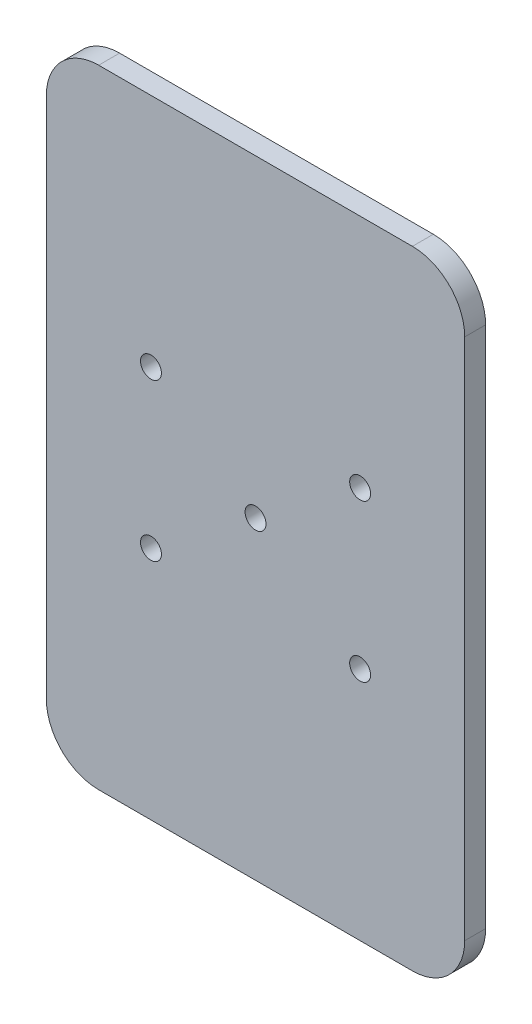
ISO-10303-21;
HEADER;
FILE_DESCRIPTION(('STEP AP214'),'2;1');
FILE_NAME('part.step','',(''),(''),'','','');
FILE_SCHEMA(('AUTOMOTIVE_DESIGN { 1 0 10303 214 1 1 1 1 }'));
ENDSEC;
DATA;
#1=APPLICATION_CONTEXT('core data for automotive mechanical design processes');
#2=APPLICATION_PROTOCOL_DEFINITION('international standard','automotive_design',2000,#1);
#3=PRODUCT_CONTEXT('',#1,'mechanical');
#4=PRODUCT('Part','Part','',(#3));
#5=PRODUCT_RELATED_PRODUCT_CATEGORY('part','',(#4));
#6=PRODUCT_DEFINITION_FORMATION('','',#4);
#7=PRODUCT_DEFINITION_CONTEXT('part definition',#1,'design');
#8=PRODUCT_DEFINITION('design','',#6,#7);
#9=PRODUCT_DEFINITION_SHAPE('','',#8);
#10=(LENGTH_UNIT() NAMED_UNIT(*) SI_UNIT(.MILLI.,.METRE.));
#11=(NAMED_UNIT(*) PLANE_ANGLE_UNIT() SI_UNIT($,.RADIAN.));
#12=(NAMED_UNIT(*) SI_UNIT($,.STERADIAN.) SOLID_ANGLE_UNIT());
#13=UNCERTAINTY_MEASURE_WITH_UNIT(LENGTH_MEASURE(1.E-05),#10,'distance_accuracy_value','');
#14=(GEOMETRIC_REPRESENTATION_CONTEXT(3) GLOBAL_UNCERTAINTY_ASSIGNED_CONTEXT((#13)) GLOBAL_UNIT_ASSIGNED_CONTEXT((#10,
#11,#12)) REPRESENTATION_CONTEXT('',''));
#15=CARTESIAN_POINT('',(0.,0.,0.));
#16=DIRECTION('',(0.,0.,1.));
#17=DIRECTION('',(1.,0.,0.));
#18=AXIS2_PLACEMENT_3D('',#15,#16,#17);
#19=CARTESIAN_POINT('',(-65.9850692997892,26.8064344030394,-2.));
#20=DIRECTION('',(0.,-1.,0.));
#21=DIRECTION('',(0.,0.,-1.));
#22=AXIS2_PLACEMENT_3D('',#19,#20,#21);
#23=PLANE('',#22);
#24=DIRECTION('',(1.,0.,0.));
#25=VECTOR('',#24,1.);
#26=CARTESIAN_POINT('',(-65.9850692997892,26.8064344030394,0.));
#27=LINE('',#26,#25);
#28=CARTESIAN_POINT('',(-60.9850692997892,26.8064344030394,0.));
#29=VERTEX_POINT('',#28);
#30=CARTESIAN_POINT('',(-30.9850692997892,26.8064344030394,0.));
#31=VERTEX_POINT('',#30);
#32=EDGE_CURVE('E148',#29,#31,#27,.T.);
#33=ORIENTED_EDGE('',*,*,#32,.T.);
#34=DIRECTION('',(0.,0.,1.));
#35=VECTOR('',#34,1.);
#36=CARTESIAN_POINT('',(-30.9850692997892,26.8064344030394,-2.));
#37=LINE('',#36,#35);
#38=CARTESIAN_POINT('',(-30.9850692997892,26.8064344030394,-2.));
#39=VERTEX_POINT('',#38);
#40=EDGE_CURVE('E123',#31,#39,#37,.F.);
#41=ORIENTED_EDGE('',*,*,#40,.T.);
#42=DIRECTION('',(1.,0.,0.));
#43=VECTOR('',#42,1.);
#44=CARTESIAN_POINT('',(-65.9850692997892,26.8064344030394,-2.));
#45=LINE('',#44,#43);
#46=CARTESIAN_POINT('',(-60.9850692997892,26.8064344030394,-2.));
#47=VERTEX_POINT('',#46);
#48=EDGE_CURVE('E161',#47,#39,#45,.T.);
#49=ORIENTED_EDGE('',*,*,#48,.F.);
#50=DIRECTION('',(0.,0.,1.));
#51=VECTOR('',#50,1.);
#52=CARTESIAN_POINT('',(-60.9850692997892,26.8064344030394,0.));
#53=LINE('',#52,#51);
#54=EDGE_CURVE('E129',#47,#29,#53,.T.);
#55=ORIENTED_EDGE('',*,*,#54,.T.);
#56=EDGE_LOOP('',(#33,#41,#49,#55));
#57=FACE_BOUND('',#56,.T.);
#58=ADVANCED_FACE('F49',(#57),#23,.F.);
#59=CARTESIAN_POINT('',(-25.9850692997892,26.8064344030394,-2.));
#60=DIRECTION('',(-1.,0.,0.));
#61=DIRECTION('',(0.,-1.,0.));
#62=AXIS2_PLACEMENT_3D('',#59,#60,#61);
#63=PLANE('',#62);
#64=DIRECTION('',(0.,-1.,0.));
#65=VECTOR('',#64,1.);
#66=CARTESIAN_POINT('',(-25.9850692997892,26.8064344030394,-2.));
#67=LINE('',#66,#65);
#68=CARTESIAN_POINT('',(-25.9850692997892,21.8064344030394,-2.));
#69=VERTEX_POINT('',#68);
#70=CARTESIAN_POINT('',(-25.9850692997892,-28.1935655969606,-2.));
#71=VERTEX_POINT('',#70);
#72=EDGE_CURVE('E139',#69,#71,#67,.T.);
#73=ORIENTED_EDGE('',*,*,#72,.F.);
#74=DIRECTION('',(0.,0.,1.));
#75=VECTOR('',#74,1.);
#76=CARTESIAN_POINT('',(-25.9850692997892,21.8064344030394,-2.));
#77=LINE('',#76,#75);
#78=CARTESIAN_POINT('',(-25.9850692997892,21.8064344030394,0.));
#79=VERTEX_POINT('',#78);
#80=EDGE_CURVE('E122',#69,#79,#77,.T.);
#81=ORIENTED_EDGE('',*,*,#80,.T.);
#82=DIRECTION('',(0.,-1.,0.));
#83=VECTOR('',#82,1.);
#84=CARTESIAN_POINT('',(-25.9850692997892,26.8064344030394,0.));
#85=LINE('',#84,#83);
#86=CARTESIAN_POINT('',(-25.9850692997892,-28.1935655969606,0.));
#87=VERTEX_POINT('',#86);
#88=EDGE_CURVE('E136',#79,#87,#85,.T.);
#89=ORIENTED_EDGE('',*,*,#88,.T.);
#90=DIRECTION('',(0.,0.,1.));
#91=VECTOR('',#90,1.);
#92=CARTESIAN_POINT('',(-25.9850692997892,-28.1935655969606,-2.));
#93=LINE('',#92,#91);
#94=EDGE_CURVE('E142',#87,#71,#93,.F.);
#95=ORIENTED_EDGE('',*,*,#94,.T.);
#96=EDGE_LOOP('',(#73,#81,#89,#95));
#97=FACE_BOUND('',#96,.T.);
#98=ADVANCED_FACE('F135',(#97),#63,.F.);
#99=CARTESIAN_POINT('',(-65.9850692997892,-33.1935655969606,-2.));
#100=DIRECTION('',(0.,-1.,0.));
#101=DIRECTION('',(0.,0.,-1.));
#102=AXIS2_PLACEMENT_3D('',#99,#100,#101);
#103=PLANE('',#102);
#104=DIRECTION('',(1.,0.,0.));
#105=VECTOR('',#104,1.);
#106=CARTESIAN_POINT('',(-65.9850692997892,-33.1935655969606,-2.));
#107=LINE('',#106,#105);
#108=CARTESIAN_POINT('',(-60.9850692997892,-33.1935655969606,-2.));
#109=VERTEX_POINT('',#108);
#110=CARTESIAN_POINT('',(-30.9850692997892,-33.1935655969606,-2.));
#111=VERTEX_POINT('',#110);
#112=EDGE_CURVE('E234',#109,#111,#107,.T.);
#113=ORIENTED_EDGE('',*,*,#112,.T.);
#114=DIRECTION('',(0.,0.,1.));
#115=VECTOR('',#114,1.);
#116=CARTESIAN_POINT('',(-30.9850692997892,-33.1935655969606,0.));
#117=LINE('',#116,#115);
#118=CARTESIAN_POINT('',(-30.9850692997892,-33.1935655969606,0.));
#119=VERTEX_POINT('',#118);
#120=EDGE_CURVE('E191',#111,#119,#117,.T.);
#121=ORIENTED_EDGE('',*,*,#120,.T.);
#122=DIRECTION('',(1.,0.,0.));
#123=VECTOR('',#122,1.);
#124=CARTESIAN_POINT('',(-65.9850692997892,-33.1935655969606,0.));
#125=LINE('',#124,#123);
#126=CARTESIAN_POINT('',(-60.9850692997892,-33.1935655969606,0.));
#127=VERTEX_POINT('',#126);
#128=EDGE_CURVE('E147',#127,#119,#125,.T.);
#129=ORIENTED_EDGE('',*,*,#128,.F.);
#130=DIRECTION('',(0.,0.,1.));
#131=VECTOR('',#130,1.);
#132=CARTESIAN_POINT('',(-60.9850692997892,-33.1935655969606,-2.));
#133=LINE('',#132,#131);
#134=EDGE_CURVE('E188',#127,#109,#133,.F.);
#135=ORIENTED_EDGE('',*,*,#134,.T.);
#136=EDGE_LOOP('',(#113,#121,#129,#135));
#137=FACE_BOUND('',#136,.T.);
#138=ADVANCED_FACE('F246',(#137),#103,.T.);
#139=CARTESIAN_POINT('',(-65.9850692997892,26.8064344030394,-2.));
#140=DIRECTION('',(-1.,0.,0.));
#141=DIRECTION('',(0.,-1.,0.));
#142=AXIS2_PLACEMENT_3D('',#139,#140,#141);
#143=PLANE('',#142);
#144=DIRECTION('',(0.,-1.,0.));
#145=VECTOR('',#144,1.);
#146=CARTESIAN_POINT('',(-65.9850692997892,26.8064344030394,-2.));
#147=LINE('',#146,#145);
#148=CARTESIAN_POINT('',(-65.9850692997892,21.8064344030394,-2.));
#149=VERTEX_POINT('',#148);
#150=CARTESIAN_POINT('',(-65.9850692997892,-28.1935655969606,-2.));
#151=VERTEX_POINT('',#150);
#152=EDGE_CURVE('E163',#149,#151,#147,.T.);
#153=ORIENTED_EDGE('',*,*,#152,.T.);
#154=DIRECTION('',(0.,0.,1.));
#155=VECTOR('',#154,1.);
#156=CARTESIAN_POINT('',(-65.9850692997892,-28.1935655969606,-2.));
#157=LINE('',#156,#155);
#158=CARTESIAN_POINT('',(-65.9850692997892,-28.1935655969606,0.));
#159=VERTEX_POINT('',#158);
#160=EDGE_CURVE('E11',#151,#159,#157,.T.);
#161=ORIENTED_EDGE('',*,*,#160,.T.);
#162=DIRECTION('',(0.,-1.,0.));
#163=VECTOR('',#162,1.);
#164=CARTESIAN_POINT('',(-65.9850692997892,26.8064344030394,0.));
#165=LINE('',#164,#163);
#166=CARTESIAN_POINT('',(-65.9850692997892,21.8064344030394,0.));
#167=VERTEX_POINT('',#166);
#168=EDGE_CURVE('E152',#167,#159,#165,.T.);
#169=ORIENTED_EDGE('',*,*,#168,.F.);
#170=DIRECTION('',(0.,0.,1.));
#171=VECTOR('',#170,1.);
#172=CARTESIAN_POINT('',(-65.9850692997892,21.8064344030394,-2.));
#173=LINE('',#172,#171);
#174=EDGE_CURVE('E59',#167,#149,#173,.F.);
#175=ORIENTED_EDGE('',*,*,#174,.T.);
#176=EDGE_LOOP('',(#153,#161,#169,#175));
#177=FACE_BOUND('',#176,.T.);
#178=ADVANCED_FACE('F239',(#177),#143,.T.);
#179=CARTESIAN_POINT('',(0.,0.,-2.));
#180=DIRECTION('',(0.,0.,-1.));
#181=DIRECTION('',(-1.,0.,0.));
#182=AXIS2_PLACEMENT_3D('',#179,#180,#181);
#183=PLANE('',#182);
#184=CARTESIAN_POINT('',(-35.9850692997892,4.30643440303937,-2.));
#185=DIRECTION('',(0.,0.,-1.));
#186=DIRECTION('',(-1.,0.,0.));
#187=AXIS2_PLACEMENT_3D('',#184,#185,#186);
#188=CIRCLE('',#187,0.999999999999998);
#189=CARTESIAN_POINT('',(-36.9850692997892,4.30643440303937,-2.));
#190=VERTEX_POINT('',#189);
#191=EDGE_CURVE('E204',#190,#190,#188,.T.);
#192=ORIENTED_EDGE('',*,*,#191,.F.);
#193=EDGE_LOOP('',(#192));
#194=FACE_BOUND('',#193,.T.);
#195=CARTESIAN_POINT('',(-35.9850692997892,-10.6935655969606,-2.));
#196=DIRECTION('',(0.,0.,-1.));
#197=DIRECTION('',(-1.,0.,0.));
#198=AXIS2_PLACEMENT_3D('',#195,#196,#197);
#199=CIRCLE('',#198,0.999999999999998);
#200=CARTESIAN_POINT('',(-36.9850692997892,-10.6935655969606,-2.));
#201=VERTEX_POINT('',#200);
#202=EDGE_CURVE('E212',#201,#201,#199,.T.);
#203=ORIENTED_EDGE('',*,*,#202,.F.);
#204=EDGE_LOOP('',(#203));
#205=FACE_BOUND('',#204,.T.);
#206=CARTESIAN_POINT('',(-55.9850692997892,4.30643440303937,-2.));
#207=DIRECTION('',(0.,0.,-1.));
#208=DIRECTION('',(-1.,0.,0.));
#209=AXIS2_PLACEMENT_3D('',#206,#207,#208);
#210=CIRCLE('',#209,0.999999999999998);
#211=CARTESIAN_POINT('',(-56.9850692997892,4.30643440303937,-2.));
#212=VERTEX_POINT('',#211);
#213=EDGE_CURVE('E222',#212,#212,#210,.F.);
#214=ORIENTED_EDGE('',*,*,#213,.T.);
#215=EDGE_LOOP('',(#214));
#216=FACE_BOUND('',#215,.T.);
#217=CARTESIAN_POINT('',(-55.9850692997892,-10.6935655969606,-2.));
#218=DIRECTION('',(0.,0.,-1.));
#219=DIRECTION('',(-1.,0.,0.));
#220=AXIS2_PLACEMENT_3D('',#217,#218,#219);
#221=CIRCLE('',#220,0.999999999999998);
#222=CARTESIAN_POINT('',(-56.9850692997892,-10.6935655969606,-2.));
#223=VERTEX_POINT('',#222);
#224=EDGE_CURVE('E203',#223,#223,#221,.F.);
#225=ORIENTED_EDGE('',*,*,#224,.T.);
#226=EDGE_LOOP('',(#225));
#227=FACE_BOUND('',#226,.T.);
#228=CARTESIAN_POINT('',(-45.9850692997892,-3.19356559696063,-2.));
#229=DIRECTION('',(0.,0.,-1.));
#230=DIRECTION('',(-1.,0.,0.));
#231=AXIS2_PLACEMENT_3D('',#228,#229,#230);
#232=CIRCLE('',#231,0.999999999999998);
#233=CARTESIAN_POINT('',(-46.9850692997892,-3.19356559696063,-2.));
#234=VERTEX_POINT('',#233);
#235=EDGE_CURVE('E199',#234,#234,#232,.T.);
#236=ORIENTED_EDGE('',*,*,#235,.F.);
#237=EDGE_LOOP('',(#236));
#238=FACE_BOUND('',#237,.T.);
#239=ORIENTED_EDGE('',*,*,#48,.T.);
#240=CARTESIAN_POINT('',(-30.9850692997892,21.8064344030394,-2.));
#241=DIRECTION('',(0.,0.,-1.));
#242=DIRECTION('',(-1.,0.,0.));
#243=AXIS2_PLACEMENT_3D('',#240,#241,#242);
#244=CIRCLE('',#243,5.);
#245=EDGE_CURVE('E185',#39,#69,#244,.T.);
#246=ORIENTED_EDGE('',*,*,#245,.T.);
#247=ORIENTED_EDGE('',*,*,#72,.T.);
#248=CARTESIAN_POINT('',(-30.9850692997892,-28.1935655969606,-2.));
#249=DIRECTION('',(0.,0.,-1.));
#250=DIRECTION('',(-1.,0.,0.));
#251=AXIS2_PLACEMENT_3D('',#248,#249,#250);
#252=CIRCLE('',#251,5.);
#253=EDGE_CURVE('E182',#71,#111,#252,.T.);
#254=ORIENTED_EDGE('',*,*,#253,.T.);
#255=ORIENTED_EDGE('',*,*,#112,.F.);
#256=CARTESIAN_POINT('',(-60.9850692997892,-28.1935655969606,-2.));
#257=DIRECTION('',(0.,0.,-1.));
#258=DIRECTION('',(-1.,0.,0.));
#259=AXIS2_PLACEMENT_3D('',#256,#257,#258);
#260=CIRCLE('',#259,5.);
#261=EDGE_CURVE('E67',#109,#151,#260,.T.);
#262=ORIENTED_EDGE('',*,*,#261,.T.);
#263=ORIENTED_EDGE('',*,*,#152,.F.);
#264=CARTESIAN_POINT('',(-60.9850692997892,21.8064344030394,-2.));
#265=DIRECTION('',(0.,0.,-1.));
#266=DIRECTION('',(-1.,0.,0.));
#267=AXIS2_PLACEMENT_3D('',#264,#265,#266);
#268=CIRCLE('',#267,5.);
#269=EDGE_CURVE('E177',#149,#47,#268,.T.);
#270=ORIENTED_EDGE('',*,*,#269,.T.);
#271=EDGE_LOOP('',(#239,#246,#247,#254,#255,#262,#263,#270));
#272=FACE_BOUND('',#271,.T.);
#273=ADVANCED_FACE('F251',(#194,#205,#216,#227,#238,#272),#183,.T.);
#274=CARTESIAN_POINT('',(0.,0.,0.));
#275=DIRECTION('',(0.,0.,-1.));
#276=DIRECTION('',(-1.,0.,0.));
#277=AXIS2_PLACEMENT_3D('',#274,#275,#276);
#278=PLANE('',#277);
#279=CARTESIAN_POINT('',(-35.9850692997892,4.30643440303937,0.));
#280=DIRECTION('',(0.,0.,1.));
#281=DIRECTION('',(1.,0.,0.));
#282=AXIS2_PLACEMENT_3D('',#279,#280,#281);
#283=CIRCLE('',#282,0.999999999999998);
#284=CARTESIAN_POINT('',(-34.9850692997892,4.30643440303937,0.));
#285=VERTEX_POINT('',#284);
#286=EDGE_CURVE('E218',#285,#285,#283,.T.);
#287=ORIENTED_EDGE('',*,*,#286,.F.);
#288=EDGE_LOOP('',(#287));
#289=FACE_BOUND('',#288,.T.);
#290=CARTESIAN_POINT('',(-35.9850692997892,-10.6935655969606,0.));
#291=DIRECTION('',(0.,0.,1.));
#292=DIRECTION('',(1.,0.,0.));
#293=AXIS2_PLACEMENT_3D('',#290,#291,#292);
#294=CIRCLE('',#293,0.999999999999998);
#295=CARTESIAN_POINT('',(-34.9850692997892,-10.6935655969606,0.));
#296=VERTEX_POINT('',#295);
#297=EDGE_CURVE('E412',#296,#296,#294,.T.);
#298=ORIENTED_EDGE('',*,*,#297,.F.);
#299=EDGE_LOOP('',(#298));
#300=FACE_BOUND('',#299,.T.);
#301=CARTESIAN_POINT('',(-55.9850692997892,4.30643440303937,0.));
#302=DIRECTION('',(0.,0.,-1.));
#303=DIRECTION('',(-1.,0.,0.));
#304=AXIS2_PLACEMENT_3D('',#301,#302,#303);
#305=CIRCLE('',#304,0.999999999999998);
#306=CARTESIAN_POINT('',(-56.9850692997892,4.30643440303937,0.));
#307=VERTEX_POINT('',#306);
#308=EDGE_CURVE('E53',#307,#307,#305,.F.);
#309=ORIENTED_EDGE('',*,*,#308,.F.);
#310=EDGE_LOOP('',(#309));
#311=FACE_BOUND('',#310,.T.);
#312=CARTESIAN_POINT('',(-55.9850692997892,-10.6935655969606,0.));
#313=DIRECTION('',(0.,0.,-1.));
#314=DIRECTION('',(-1.,0.,0.));
#315=AXIS2_PLACEMENT_3D('',#312,#313,#314);
#316=CIRCLE('',#315,0.999999999999998);
#317=CARTESIAN_POINT('',(-56.9850692997892,-10.6935655969606,0.));
#318=VERTEX_POINT('',#317);
#319=EDGE_CURVE('E200',#318,#318,#316,.F.);
#320=ORIENTED_EDGE('',*,*,#319,.F.);
#321=EDGE_LOOP('',(#320));
#322=FACE_BOUND('',#321,.T.);
#323=CARTESIAN_POINT('',(-45.9850692997892,-3.19356559696063,0.));
#324=DIRECTION('',(0.,0.,-1.));
#325=DIRECTION('',(-1.,0.,0.));
#326=AXIS2_PLACEMENT_3D('',#323,#324,#325);
#327=CIRCLE('',#326,0.999999999999998);
#328=CARTESIAN_POINT('',(-46.9850692997892,-3.19356559696063,0.));
#329=VERTEX_POINT('',#328);
#330=EDGE_CURVE('E154',#329,#329,#327,.T.);
#331=ORIENTED_EDGE('',*,*,#330,.T.);
#332=EDGE_LOOP('',(#331));
#333=FACE_BOUND('',#332,.T.);
#334=ORIENTED_EDGE('',*,*,#88,.F.);
#335=CARTESIAN_POINT('',(-30.9850692997892,21.8064344030394,0.));
#336=DIRECTION('',(0.,0.,-1.));
#337=DIRECTION('',(-1.,0.,0.));
#338=AXIS2_PLACEMENT_3D('',#335,#336,#337);
#339=CIRCLE('',#338,5.);
#340=EDGE_CURVE('E118',#79,#31,#339,.F.);
#341=ORIENTED_EDGE('',*,*,#340,.T.);
#342=ORIENTED_EDGE('',*,*,#32,.F.);
#343=CARTESIAN_POINT('',(-60.9850692997892,21.8064344030394,0.));
#344=DIRECTION('',(0.,0.,-1.));
#345=DIRECTION('',(-1.,0.,0.));
#346=AXIS2_PLACEMENT_3D('',#343,#344,#345);
#347=CIRCLE('',#346,5.);
#348=EDGE_CURVE('E141',#29,#167,#347,.F.);
#349=ORIENTED_EDGE('',*,*,#348,.T.);
#350=ORIENTED_EDGE('',*,*,#168,.T.);
#351=CARTESIAN_POINT('',(-60.9850692997892,-28.1935655969606,0.));
#352=DIRECTION('',(0.,0.,-1.));
#353=DIRECTION('',(-1.,0.,0.));
#354=AXIS2_PLACEMENT_3D('',#351,#352,#353);
#355=CIRCLE('',#354,5.);
#356=EDGE_CURVE('E167',#159,#127,#355,.F.);
#357=ORIENTED_EDGE('',*,*,#356,.T.);
#358=ORIENTED_EDGE('',*,*,#128,.T.);
#359=CARTESIAN_POINT('',(-30.9850692997892,-28.1935655969606,0.));
#360=DIRECTION('',(0.,0.,-1.));
#361=DIRECTION('',(-1.,0.,0.));
#362=AXIS2_PLACEMENT_3D('',#359,#360,#361);
#363=CIRCLE('',#362,5.);
#364=EDGE_CURVE('E130',#119,#87,#363,.F.);
#365=ORIENTED_EDGE('',*,*,#364,.T.);
#366=EDGE_LOOP('',(#334,#341,#342,#349,#350,#357,#358,#365));
#367=FACE_BOUND('',#366,.T.);
#368=ADVANCED_FACE('F144',(#289,#300,#311,#322,#333,#367),#278,.F.);
#369=CARTESIAN_POINT('',(-30.9850692997892,21.8064344030394,-2.));
#370=DIRECTION('',(0.,0.,1.));
#371=DIRECTION('',(1.,0.,0.));
#372=AXIS2_PLACEMENT_3D('',#369,#370,#371);
#373=CYLINDRICAL_SURFACE('',#372,5.);
#374=ORIENTED_EDGE('',*,*,#245,.F.);
#375=ORIENTED_EDGE('',*,*,#40,.F.);
#376=ORIENTED_EDGE('',*,*,#340,.F.);
#377=ORIENTED_EDGE('',*,*,#80,.F.);
#378=EDGE_LOOP('',(#374,#375,#376,#377));
#379=FACE_BOUND('',#378,.T.);
#380=ADVANCED_FACE('F121',(#379),#373,.T.);
#381=CARTESIAN_POINT('',(-30.9850692997892,-28.1935655969606,-2.));
#382=DIRECTION('',(0.,0.,-1.));
#383=DIRECTION('',(-1.,0.,0.));
#384=AXIS2_PLACEMENT_3D('',#381,#382,#383);
#385=CYLINDRICAL_SURFACE('',#384,5.);
#386=ORIENTED_EDGE('',*,*,#253,.F.);
#387=ORIENTED_EDGE('',*,*,#94,.F.);
#388=ORIENTED_EDGE('',*,*,#364,.F.);
#389=ORIENTED_EDGE('',*,*,#120,.F.);
#390=EDGE_LOOP('',(#386,#387,#388,#389));
#391=FACE_BOUND('',#390,.T.);
#392=ADVANCED_FACE('F250',(#391),#385,.T.);
#393=CARTESIAN_POINT('',(-60.9850692997892,-28.1935655969606,-2.));
#394=DIRECTION('',(0.,0.,1.));
#395=DIRECTION('',(1.,0.,0.));
#396=AXIS2_PLACEMENT_3D('',#393,#394,#395);
#397=CYLINDRICAL_SURFACE('',#396,5.);
#398=ORIENTED_EDGE('',*,*,#261,.F.);
#399=ORIENTED_EDGE('',*,*,#134,.F.);
#400=ORIENTED_EDGE('',*,*,#356,.F.);
#401=ORIENTED_EDGE('',*,*,#160,.F.);
#402=EDGE_LOOP('',(#398,#399,#400,#401));
#403=FACE_BOUND('',#402,.T.);
#404=ADVANCED_FACE('F242',(#403),#397,.T.);
#405=CARTESIAN_POINT('',(-60.9850692997892,21.8064344030394,-2.));
#406=DIRECTION('',(0.,0.,-1.));
#407=DIRECTION('',(-1.,0.,0.));
#408=AXIS2_PLACEMENT_3D('',#405,#406,#407);
#409=CYLINDRICAL_SURFACE('',#408,5.);
#410=ORIENTED_EDGE('',*,*,#269,.F.);
#411=ORIENTED_EDGE('',*,*,#174,.F.);
#412=ORIENTED_EDGE('',*,*,#348,.F.);
#413=ORIENTED_EDGE('',*,*,#54,.F.);
#414=EDGE_LOOP('',(#410,#411,#412,#413));
#415=FACE_BOUND('',#414,.T.);
#416=ADVANCED_FACE('F51',(#415),#409,.T.);
#417=CARTESIAN_POINT('',(-45.9850692997892,-3.19356559696063,10.));
#418=DIRECTION('',(0.,0.,-1.));
#419=DIRECTION('',(-1.,0.,0.));
#420=AXIS2_PLACEMENT_3D('',#417,#418,#419);
#421=CYLINDRICAL_SURFACE('',#420,0.999999999999998);
#422=ORIENTED_EDGE('',*,*,#235,.T.);
#423=EDGE_LOOP('',(#422));
#424=FACE_BOUND('',#423,.T.);
#425=ORIENTED_EDGE('',*,*,#330,.F.);
#426=EDGE_LOOP('',(#425));
#427=FACE_BOUND('',#426,.T.);
#428=ADVANCED_FACE('F257',(#424,#427),#421,.F.);
#429=CARTESIAN_POINT('',(-55.9850692997892,-10.6935655969606,-10.));
#430=DIRECTION('',(0.,0.,1.));
#431=DIRECTION('',(1.,0.,0.));
#432=AXIS2_PLACEMENT_3D('',#429,#430,#431);
#433=CYLINDRICAL_SURFACE('',#432,0.999999999999998);
#434=ORIENTED_EDGE('',*,*,#224,.F.);
#435=EDGE_LOOP('',(#434));
#436=FACE_BOUND('',#435,.T.);
#437=ORIENTED_EDGE('',*,*,#319,.T.);
#438=EDGE_LOOP('',(#437));
#439=FACE_BOUND('',#438,.T.);
#440=ADVANCED_FACE('F263',(#436,#439),#433,.F.);
#441=CARTESIAN_POINT('',(-55.9850692997892,4.30643440303937,-10.));
#442=DIRECTION('',(0.,0.,1.));
#443=DIRECTION('',(1.,0.,0.));
#444=AXIS2_PLACEMENT_3D('',#441,#442,#443);
#445=CYLINDRICAL_SURFACE('',#444,0.999999999999998);
#446=ORIENTED_EDGE('',*,*,#213,.F.);
#447=EDGE_LOOP('',(#446));
#448=FACE_BOUND('',#447,.T.);
#449=ORIENTED_EDGE('',*,*,#308,.T.);
#450=EDGE_LOOP('',(#449));
#451=FACE_BOUND('',#450,.T.);
#452=ADVANCED_FACE('F367',(#448,#451),#445,.F.);
#453=CARTESIAN_POINT('',(-35.9850692997892,-10.6935655969606,-10.));
#454=DIRECTION('',(0.,0.,1.));
#455=DIRECTION('',(1.,0.,0.));
#456=AXIS2_PLACEMENT_3D('',#453,#454,#455);
#457=CYLINDRICAL_SURFACE('',#456,0.999999999999998);
#458=ORIENTED_EDGE('',*,*,#202,.T.);
#459=EDGE_LOOP('',(#458));
#460=FACE_BOUND('',#459,.T.);
#461=ORIENTED_EDGE('',*,*,#297,.T.);
#462=EDGE_LOOP('',(#461));
#463=FACE_BOUND('',#462,.T.);
#464=ADVANCED_FACE('F376',(#460,#463),#457,.F.);
#465=CARTESIAN_POINT('',(-35.9850692997892,4.30643440303937,-10.));
#466=DIRECTION('',(0.,0.,1.));
#467=DIRECTION('',(1.,0.,0.));
#468=AXIS2_PLACEMENT_3D('',#465,#466,#467);
#469=CYLINDRICAL_SURFACE('',#468,0.999999999999998);
#470=ORIENTED_EDGE('',*,*,#191,.T.);
#471=EDGE_LOOP('',(#470));
#472=FACE_BOUND('',#471,.T.);
#473=ORIENTED_EDGE('',*,*,#286,.T.);
#474=EDGE_LOOP('',(#473));
#475=FACE_BOUND('',#474,.T.);
#476=ADVANCED_FACE('F385',(#472,#475),#469,.F.);
#477=CLOSED_SHELL('',(#58,#98,#138,#178,#273,#368,#380,#392,#404,#416,#428,#440,#452,#464,#476));
#478=MANIFOLD_SOLID_BREP('B2',#477);
#479=ADVANCED_BREP_SHAPE_REPRESENTATION('',(#18,#478),#14);
#480=SHAPE_DEFINITION_REPRESENTATION(#9,#479);
ENDSEC;
END-ISO-10303-21;
